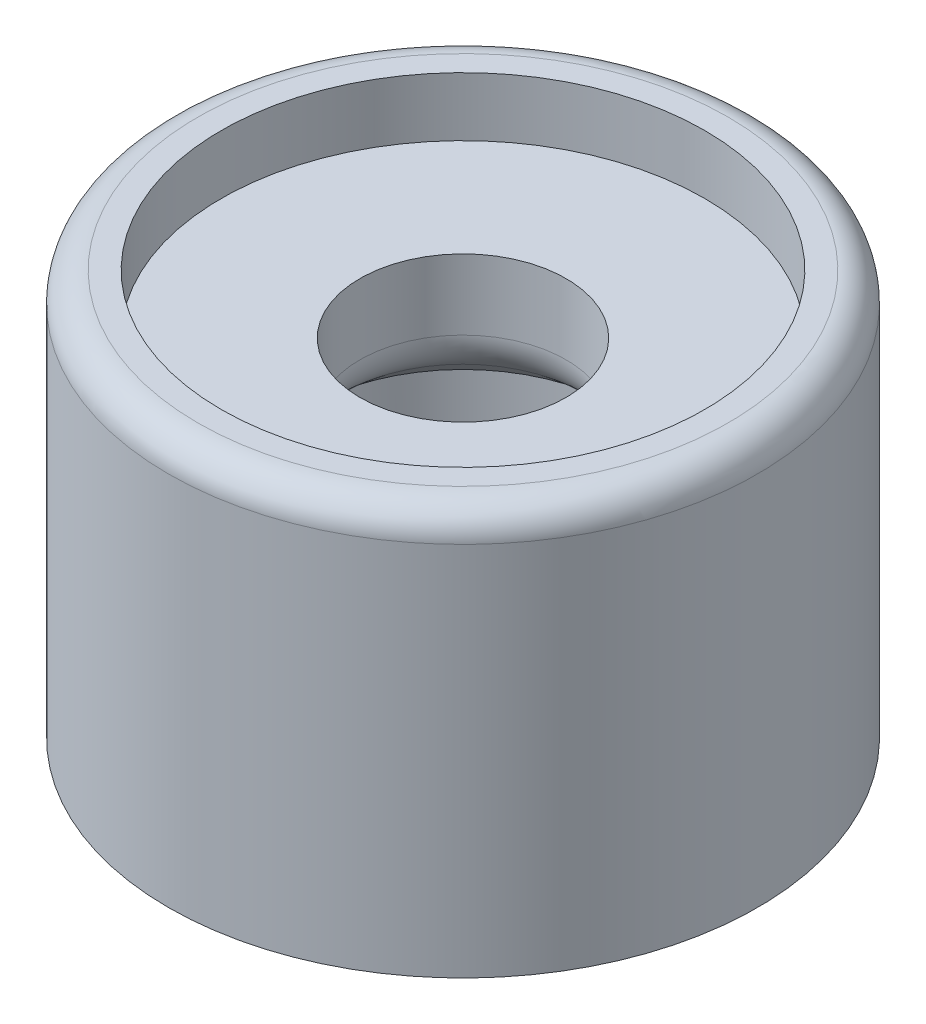
ISO-10303-21;
HEADER;
FILE_DESCRIPTION(('STEP AP214'),'2;1');
FILE_NAME('part.step','',(''),(''),'','','');
FILE_SCHEMA(('AUTOMOTIVE_DESIGN { 1 0 10303 214 1 1 1 1 }'));
ENDSEC;
DATA;
#1=APPLICATION_CONTEXT('core data for automotive mechanical design processes');
#2=APPLICATION_PROTOCOL_DEFINITION('international standard','automotive_design',2000,#1);
#3=PRODUCT_CONTEXT('',#1,'mechanical');
#4=PRODUCT('Part','Part','',(#3));
#5=PRODUCT_RELATED_PRODUCT_CATEGORY('part','',(#4));
#6=PRODUCT_DEFINITION_FORMATION('','',#4);
#7=PRODUCT_DEFINITION_CONTEXT('part definition',#1,'design');
#8=PRODUCT_DEFINITION('design','',#6,#7);
#9=PRODUCT_DEFINITION_SHAPE('','',#8);
#10=(LENGTH_UNIT() NAMED_UNIT(*) SI_UNIT(.MILLI.,.METRE.));
#11=(NAMED_UNIT(*) PLANE_ANGLE_UNIT() SI_UNIT($,.RADIAN.));
#12=(NAMED_UNIT(*) SI_UNIT($,.STERADIAN.) SOLID_ANGLE_UNIT());
#13=UNCERTAINTY_MEASURE_WITH_UNIT(LENGTH_MEASURE(1.E-05),#10,'distance_accuracy_value','');
#14=(GEOMETRIC_REPRESENTATION_CONTEXT(3) GLOBAL_UNCERTAINTY_ASSIGNED_CONTEXT((#13)) GLOBAL_UNIT_ASSIGNED_CONTEXT((#10,
#11,#12)) REPRESENTATION_CONTEXT('',''));
#15=CARTESIAN_POINT('',(0.,0.,0.));
#16=DIRECTION('',(0.,0.,1.));
#17=DIRECTION('',(1.,0.,0.));
#18=AXIS2_PLACEMENT_3D('',#15,#16,#17);
#19=CARTESIAN_POINT('',(0.,0.,0.));
#20=DIRECTION('',(0.,-1.,0.));
#21=DIRECTION('',(0.,0.,-1.));
#22=AXIS2_PLACEMENT_3D('',#19,#20,#21);
#23=CYLINDRICAL_SURFACE('',#22,2.1);
#24=CARTESIAN_POINT('',(0.,5.61698371095907,0.));
#25=DIRECTION('',(0.,1.,0.));
#26=DIRECTION('',(0.,0.,1.));
#27=AXIS2_PLACEMENT_3D('',#24,#25,#26);
#28=CIRCLE('',#27,2.1);
#29=CARTESIAN_POINT('',(0.,5.61698371095907,2.1));
#30=VERTEX_POINT('',#29);
#31=EDGE_CURVE('E40',#30,#30,#28,.F.);
#32=ORIENTED_EDGE('',*,*,#31,.T.);
#33=EDGE_LOOP('',(#32));
#34=FACE_BOUND('',#33,.T.);
#35=CARTESIAN_POINT('',(0.,7.05,0.));
#36=DIRECTION('',(0.,1.,0.));
#37=DIRECTION('',(0.,0.,1.));
#38=AXIS2_PLACEMENT_3D('',#35,#36,#37);
#39=CIRCLE('',#38,2.1);
#40=CARTESIAN_POINT('',(0.,7.05,2.1));
#41=VERTEX_POINT('',#40);
#42=EDGE_CURVE('E54',#41,#41,#39,.F.);
#43=ORIENTED_EDGE('',*,*,#42,.F.);
#44=EDGE_LOOP('',(#43));
#45=FACE_BOUND('',#44,.T.);
#46=ADVANCED_FACE('F33',(#34,#45),#23,.F.);
#47=CARTESIAN_POINT('',(0.,0.,0.));
#48=DIRECTION('',(0.,1.,0.));
#49=DIRECTION('',(0.,0.,1.));
#50=AXIS2_PLACEMENT_3D('',#47,#48,#49);
#51=PLANE('',#50);
#52=CARTESIAN_POINT('',(0.,0.,0.));
#53=DIRECTION('',(0.,1.,0.));
#54=DIRECTION('',(0.,0.,1.));
#55=AXIS2_PLACEMENT_3D('',#52,#53,#54);
#56=CIRCLE('',#55,4.175);
#57=CARTESIAN_POINT('',(0.,0.,4.175));
#58=VERTEX_POINT('',#57);
#59=EDGE_CURVE('E48',#58,#58,#56,.T.);
#60=ORIENTED_EDGE('',*,*,#59,.T.);
#61=EDGE_LOOP('',(#60));
#62=FACE_BOUND('',#61,.T.);
#63=CARTESIAN_POINT('',(0.,0.,0.));
#64=DIRECTION('',(0.,1.,0.));
#65=DIRECTION('',(0.,0.,1.));
#66=AXIS2_PLACEMENT_3D('',#63,#64,#65);
#67=CIRCLE('',#66,6.);
#68=CARTESIAN_POINT('',(0.,0.,6.));
#69=VERTEX_POINT('',#68);
#70=EDGE_CURVE('E64',#69,#69,#67,.T.);
#71=ORIENTED_EDGE('',*,*,#70,.F.);
#72=EDGE_LOOP('',(#71));
#73=FACE_BOUND('',#72,.T.);
#74=ADVANCED_FACE('F103',(#62,#73),#51,.F.);
#75=CARTESIAN_POINT('',(0.,4.25,0.));
#76=DIRECTION('',(0.,-1.,0.));
#77=DIRECTION('',(0.,0.,-1.));
#78=AXIS2_PLACEMENT_3D('',#75,#76,#77);
#79=CYLINDRICAL_SURFACE('',#78,6.);
#80=CARTESIAN_POINT('',(0.,7.65,0.));
#81=DIRECTION('',(0.,1.,0.));
#82=DIRECTION('',(0.,0.,1.));
#83=AXIS2_PLACEMENT_3D('',#80,#81,#82);
#84=CIRCLE('',#83,6.);
#85=CARTESIAN_POINT('',(0.,7.65,6.));
#86=VERTEX_POINT('',#85);
#87=EDGE_CURVE('E53',#86,#86,#84,.F.);
#88=ORIENTED_EDGE('',*,*,#87,.T.);
#89=EDGE_LOOP('',(#88));
#90=FACE_BOUND('',#89,.T.);
#91=ORIENTED_EDGE('',*,*,#70,.T.);
#92=EDGE_LOOP('',(#91));
#93=FACE_BOUND('',#92,.T.);
#94=ADVANCED_FACE('F108',(#90,#93),#79,.T.);
#95=CARTESIAN_POINT('',(0.,4.25,0.));
#96=DIRECTION('',(0.,-1.,0.));
#97=DIRECTION('',(0.,0.,-1.));
#98=AXIS2_PLACEMENT_3D('',#95,#96,#97);
#99=CYLINDRICAL_SURFACE('',#98,3.175);
#100=CARTESIAN_POINT('',(0.,1.,0.));
#101=DIRECTION('',(0.,1.,0.));
#102=DIRECTION('',(0.,0.,1.));
#103=AXIS2_PLACEMENT_3D('',#100,#101,#102);
#104=CIRCLE('',#103,3.175);
#105=CARTESIAN_POINT('',(0.,1.,3.175));
#106=VERTEX_POINT('',#105);
#107=EDGE_CURVE('E44',#106,#106,#104,.F.);
#108=ORIENTED_EDGE('',*,*,#107,.T.);
#109=EDGE_LOOP('',(#108));
#110=FACE_BOUND('',#109,.T.);
#111=CARTESIAN_POINT('',(0.,4.25,0.));
#112=DIRECTION('',(0.,-1.,0.));
#113=DIRECTION('',(0.,0.,-1.));
#114=AXIS2_PLACEMENT_3D('',#111,#112,#113);
#115=CIRCLE('',#114,3.175);
#116=CARTESIAN_POINT('',(0.,4.25,-3.175));
#117=VERTEX_POINT('',#116);
#118=EDGE_CURVE('E57',#117,#117,#115,.T.);
#119=ORIENTED_EDGE('',*,*,#118,.F.);
#120=EDGE_LOOP('',(#119));
#121=FACE_BOUND('',#120,.T.);
#122=ADVANCED_FACE('F114',(#110,#121),#99,.F.);
#123=CARTESIAN_POINT('',(0.,4.25,0.));
#124=DIRECTION('',(0.,-1.,0.));
#125=DIRECTION('',(0.,0.,-1.));
#126=AXIS2_PLACEMENT_3D('',#123,#124,#125);
#127=CONICAL_SURFACE('',#126,3.175,0.873774949542297);
#128=CARTESIAN_POINT('',(0.,4.85022603796596,0.));
#129=DIRECTION('',(0.,1.,0.));
#130=DIRECTION('',(0.,0.,1.));
#131=AXIS2_PLACEMENT_3D('',#128,#129,#130);
#132=CIRCLE('',#131,2.45806334354066);
#133=CARTESIAN_POINT('',(0.,4.85022603796596,2.45806334354066));
#134=VERTEX_POINT('',#133);
#135=EDGE_CURVE('E10',#134,#134,#132,.T.);
#136=ORIENTED_EDGE('',*,*,#135,.T.);
#137=EDGE_LOOP('',(#136));
#138=FACE_BOUND('',#137,.T.);
#139=ORIENTED_EDGE('',*,*,#118,.T.);
#140=EDGE_LOOP('',(#139));
#141=FACE_BOUND('',#140,.T.);
#142=ADVANCED_FACE('F89',(#138,#141),#127,.F.);
#143=CARTESIAN_POINT('',(0.,8.25,0.));
#144=DIRECTION('',(0.,1.,0.));
#145=DIRECTION('',(0.,0.,1.));
#146=AXIS2_PLACEMENT_3D('',#143,#144,#145);
#147=PLANE('',#146);
#148=CARTESIAN_POINT('',(0.,8.25,0.));
#149=DIRECTION('',(0.,1.,0.));
#150=DIRECTION('',(0.,0.,1.));
#151=AXIS2_PLACEMENT_3D('',#148,#149,#150);
#152=CIRCLE('',#151,4.925);
#153=CARTESIAN_POINT('',(0.,8.25,4.925));
#154=VERTEX_POINT('',#153);
#155=EDGE_CURVE('E69',#154,#154,#152,.T.);
#156=ORIENTED_EDGE('',*,*,#155,.F.);
#157=EDGE_LOOP('',(#156));
#158=FACE_BOUND('',#157,.T.);
#159=CARTESIAN_POINT('',(0.,8.25,0.));
#160=DIRECTION('',(0.,1.,0.));
#161=DIRECTION('',(0.,0.,1.));
#162=AXIS2_PLACEMENT_3D('',#159,#160,#161);
#163=CIRCLE('',#162,5.4);
#164=CARTESIAN_POINT('',(0.,8.25,5.4));
#165=VERTEX_POINT('',#164);
#166=EDGE_CURVE('E61',#165,#165,#163,.T.);
#167=ORIENTED_EDGE('',*,*,#166,.T.);
#168=EDGE_LOOP('',(#167));
#169=FACE_BOUND('',#168,.T.);
#170=ADVANCED_FACE('F85',(#158,#169),#147,.T.);
#171=CARTESIAN_POINT('',(0.,7.65,0.));
#172=DIRECTION('',(0.,1.,0.));
#173=DIRECTION('',(0.,0.,1.));
#174=AXIS2_PLACEMENT_3D('',#171,#172,#173);
#175=TOROIDAL_SURFACE('',#174,5.4,0.6);
#176=ORIENTED_EDGE('',*,*,#87,.F.);
#177=EDGE_LOOP('',(#176));
#178=FACE_BOUND('',#177,.T.);
#179=ORIENTED_EDGE('',*,*,#166,.F.);
#180=EDGE_LOOP('',(#179));
#181=FACE_BOUND('',#180,.T.);
#182=ADVANCED_FACE('F88',(#178,#181),#175,.T.);
#183=CARTESIAN_POINT('',(0.,7.05,0.));
#184=DIRECTION('',(0.,1.,0.));
#185=DIRECTION('',(0.,0.,1.));
#186=AXIS2_PLACEMENT_3D('',#183,#184,#185);
#187=PLANE('',#186);
#188=CARTESIAN_POINT('',(0.,7.05,0.));
#189=DIRECTION('',(0.,1.,0.));
#190=DIRECTION('',(0.,0.,1.));
#191=AXIS2_PLACEMENT_3D('',#188,#189,#190);
#192=CIRCLE('',#191,4.925);
#193=CARTESIAN_POINT('',(0.,7.05,4.925));
#194=VERTEX_POINT('',#193);
#195=EDGE_CURVE('E58',#194,#194,#192,.T.);
#196=ORIENTED_EDGE('',*,*,#195,.T.);
#197=EDGE_LOOP('',(#196));
#198=FACE_BOUND('',#197,.T.);
#199=ORIENTED_EDGE('',*,*,#42,.T.);
#200=EDGE_LOOP('',(#199));
#201=FACE_BOUND('',#200,.T.);
#202=ADVANCED_FACE('F75',(#198,#201),#187,.T.);
#203=CARTESIAN_POINT('',(0.,7.05,0.));
#204=DIRECTION('',(0.,1.,0.));
#205=DIRECTION('',(0.,0.,1.));
#206=AXIS2_PLACEMENT_3D('',#203,#204,#205);
#207=CYLINDRICAL_SURFACE('',#206,4.925);
#208=ORIENTED_EDGE('',*,*,#195,.F.);
#209=EDGE_LOOP('',(#208));
#210=FACE_BOUND('',#209,.T.);
#211=ORIENTED_EDGE('',*,*,#155,.T.);
#212=EDGE_LOOP('',(#211));
#213=FACE_BOUND('',#212,.T.);
#214=ADVANCED_FACE('F78',(#210,#213),#207,.F.);
#215=CARTESIAN_POINT('',(0.,0.,0.));
#216=DIRECTION('',(0.,-1.,0.));
#217=DIRECTION('',(0.,0.,-1.));
#218=AXIS2_PLACEMENT_3D('',#215,#216,#217);
#219=CONICAL_SURFACE('',#218,4.175,0.785398163397446);
#220=ORIENTED_EDGE('',*,*,#107,.F.);
#221=EDGE_LOOP('',(#220));
#222=FACE_BOUND('',#221,.T.);
#223=ORIENTED_EDGE('',*,*,#59,.F.);
#224=EDGE_LOOP('',(#223));
#225=FACE_BOUND('',#224,.T.);
#226=ADVANCED_FACE('F81',(#222,#225),#219,.F.);
#227=CARTESIAN_POINT('',(0.,5.61698371095907,0.));
#228=DIRECTION('',(0.,1.,0.));
#229=DIRECTION('',(0.,0.,1.));
#230=AXIS2_PLACEMENT_3D('',#227,#228,#229);
#231=TOROIDAL_SURFACE('',#230,3.1,1.);
#232=ORIENTED_EDGE('',*,*,#135,.F.);
#233=EDGE_LOOP('',(#232));
#234=FACE_BOUND('',#233,.T.);
#235=ORIENTED_EDGE('',*,*,#31,.F.);
#236=EDGE_LOOP('',(#235));
#237=FACE_BOUND('',#236,.T.);
#238=ADVANCED_FACE('F35',(#234,#237),#231,.T.);
#239=CLOSED_SHELL('',(#46,#74,#94,#122,#142,#170,#182,#202,#214,#226,#238));
#240=MANIFOLD_SOLID_BREP('B2',#239);
#241=ADVANCED_BREP_SHAPE_REPRESENTATION('',(#18,#240),#14);
#242=SHAPE_DEFINITION_REPRESENTATION(#9,#241);
ENDSEC;
END-ISO-10303-21;
